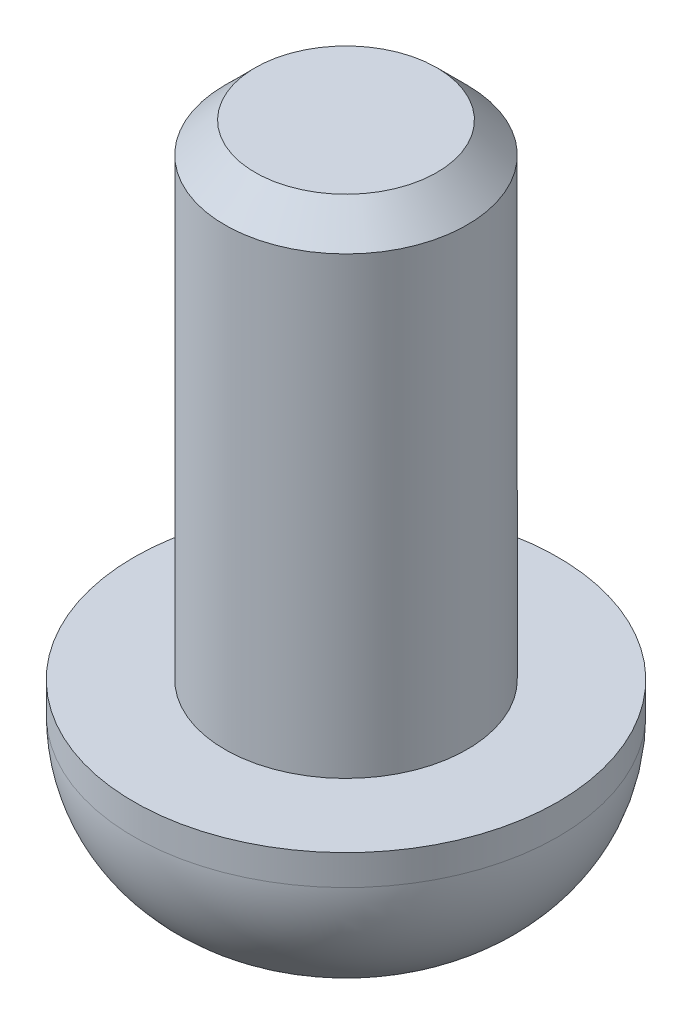
ISO-10303-21;
HEADER;
FILE_DESCRIPTION(('STEP AP214'),'2;1');
FILE_NAME('part.step','',(''),(''),'','','');
FILE_SCHEMA(('AUTOMOTIVE_DESIGN { 1 0 10303 214 1 1 1 1 }'));
ENDSEC;
DATA;
#1=APPLICATION_CONTEXT('core data for automotive mechanical design processes');
#2=APPLICATION_PROTOCOL_DEFINITION('international standard','automotive_design',2000,#1);
#3=PRODUCT_CONTEXT('',#1,'mechanical');
#4=PRODUCT('Part','Part','',(#3));
#5=PRODUCT_RELATED_PRODUCT_CATEGORY('part','',(#4));
#6=PRODUCT_DEFINITION_FORMATION('','',#4);
#7=PRODUCT_DEFINITION_CONTEXT('part definition',#1,'design');
#8=PRODUCT_DEFINITION('design','',#6,#7);
#9=PRODUCT_DEFINITION_SHAPE('','',#8);
#10=(LENGTH_UNIT() NAMED_UNIT(*) SI_UNIT(.MILLI.,.METRE.));
#11=(NAMED_UNIT(*) PLANE_ANGLE_UNIT() SI_UNIT($,.RADIAN.));
#12=(NAMED_UNIT(*) SI_UNIT($,.STERADIAN.) SOLID_ANGLE_UNIT());
#13=UNCERTAINTY_MEASURE_WITH_UNIT(LENGTH_MEASURE(1.E-05),#10,'distance_accuracy_value','');
#14=(GEOMETRIC_REPRESENTATION_CONTEXT(3) GLOBAL_UNCERTAINTY_ASSIGNED_CONTEXT((#13)) GLOBAL_UNIT_ASSIGNED_CONTEXT((#10,
#11,#12)) REPRESENTATION_CONTEXT('',''));
#15=CARTESIAN_POINT('',(0.,0.,0.));
#16=DIRECTION('',(0.,0.,1.));
#17=DIRECTION('',(1.,0.,0.));
#18=AXIS2_PLACEMENT_3D('',#15,#16,#17);
#19=CARTESIAN_POINT('',(12.7,63.6,17.1));
#20=DIRECTION('',(0.,-1.,0.));
#21=DIRECTION('',(1.,0.,0.));
#22=AXIS2_PLACEMENT_3D('',#19,#20,#21);
#23=PLANE('',#22);
#24=DIRECTION('',(-0.5,0.,-0.866025403784439));
#25=VECTOR('',#24,1.);
#26=CARTESIAN_POINT('',(13.2629165124599,63.6,16.775));
#27=LINE('',#26,#25);
#28=CARTESIAN_POINT('',(13.0752776749733,63.6,16.45));
#29=VERTEX_POINT('',#28);
#30=CARTESIAN_POINT('',(13.4505553499465,63.6,17.1));
#31=VERTEX_POINT('',#30);
#32=EDGE_CURVE('E67',#29,#31,#27,.F.);
#33=ORIENTED_EDGE('',*,*,#32,.T.);
#34=DIRECTION('',(0.5,0.,-0.866025403784439));
#35=VECTOR('',#34,1.);
#36=CARTESIAN_POINT('',(13.2629165124599,63.6,17.425));
#37=LINE('',#36,#35);
#38=CARTESIAN_POINT('',(13.0752776749733,63.6,17.75));
#39=VERTEX_POINT('',#38);
#40=EDGE_CURVE('E69',#31,#39,#37,.F.);
#41=ORIENTED_EDGE('',*,*,#40,.T.);
#42=DIRECTION('',(1.,0.,0.));
#43=VECTOR('',#42,1.);
#44=CARTESIAN_POINT('',(12.8876388374866,63.6,17.75));
#45=LINE('',#44,#43);
#46=CARTESIAN_POINT('',(12.3247223250267,63.6,17.75));
#47=VERTEX_POINT('',#46);
#48=EDGE_CURVE('E71',#39,#47,#45,.F.);
#49=ORIENTED_EDGE('',*,*,#48,.T.);
#50=DIRECTION('',(0.5,0.,0.866025403784439));
#51=VECTOR('',#50,1.);
#52=CARTESIAN_POINT('',(12.1370834875401,63.6,17.425));
#53=LINE('',#52,#51);
#54=CARTESIAN_POINT('',(11.9494446500535,63.6,17.1));
#55=VERTEX_POINT('',#54);
#56=EDGE_CURVE('E127',#47,#55,#53,.F.);
#57=ORIENTED_EDGE('',*,*,#56,.T.);
#58=DIRECTION('',(-0.5,0.,0.866025403784439));
#59=VECTOR('',#58,1.);
#60=CARTESIAN_POINT('',(12.1370834875401,63.6,16.775));
#61=LINE('',#60,#59);
#62=CARTESIAN_POINT('',(12.3247223250267,63.6,16.45));
#63=VERTEX_POINT('',#62);
#64=EDGE_CURVE('E132',#55,#63,#61,.F.);
#65=ORIENTED_EDGE('',*,*,#64,.T.);
#66=DIRECTION('',(-1.,0.,0.));
#67=VECTOR('',#66,1.);
#68=CARTESIAN_POINT('',(12.7,63.6,16.45));
#69=LINE('',#68,#67);
#70=EDGE_CURVE('E136',#63,#29,#69,.F.);
#71=ORIENTED_EDGE('',*,*,#70,.T.);
#72=EDGE_LOOP('',(#33,#41,#49,#57,#65,#71));
#73=FACE_BOUND('',#72,.T.);
#74=ADVANCED_FACE('F16',(#73),#23,.T.);
#75=CARTESIAN_POINT('',(12.8876388374866,63.6,17.75));
#76=DIRECTION('',(0.,0.,1.));
#77=DIRECTION('',(0.,-1.,0.));
#78=AXIS2_PLACEMENT_3D('',#75,#76,#77);
#79=PLANE('',#78);
#80=DIRECTION('',(0.,1.,0.));
#81=VECTOR('',#80,1.);
#82=CARTESIAN_POINT('',(12.3247223250267,63.6,17.75));
#83=LINE('',#82,#81);
#84=CARTESIAN_POINT('',(12.3247223250267,63.,17.75));
#85=VERTEX_POINT('',#84);
#86=EDGE_CURVE('E82',#85,#47,#83,.T.);
#87=ORIENTED_EDGE('',*,*,#86,.T.);
#88=ORIENTED_EDGE('',*,*,#48,.F.);
#89=DIRECTION('',(0.,1.,0.));
#90=VECTOR('',#89,1.);
#91=CARTESIAN_POINT('',(13.0752776749733,63.6,17.75));
#92=LINE('',#91,#90);
#93=CARTESIAN_POINT('',(13.0752776749733,63.,17.75));
#94=VERTEX_POINT('',#93);
#95=EDGE_CURVE('E76',#39,#94,#92,.F.);
#96=ORIENTED_EDGE('',*,*,#95,.T.);
#97=DIRECTION('',(1.,0.,0.));
#98=VECTOR('',#97,1.);
#99=CARTESIAN_POINT('',(12.7,63.,17.75));
#100=LINE('',#99,#98);
#101=EDGE_CURVE('E124',#85,#94,#100,.T.);
#102=ORIENTED_EDGE('',*,*,#101,.F.);
#103=EDGE_LOOP('',(#87,#88,#96,#102));
#104=FACE_BOUND('',#103,.T.);
#105=ADVANCED_FACE('F79',(#104),#79,.F.);
#106=CARTESIAN_POINT('',(13.2629165124599,63.6,17.425));
#107=DIRECTION('',(0.866025403784439,0.,0.5));
#108=DIRECTION('',(0.5,0.,-0.866025403784439));
#109=AXIS2_PLACEMENT_3D('',#106,#107,#108);
#110=PLANE('',#109);
#111=ORIENTED_EDGE('',*,*,#95,.F.);
#112=ORIENTED_EDGE('',*,*,#40,.F.);
#113=DIRECTION('',(0.,1.,0.));
#114=VECTOR('',#113,1.);
#115=CARTESIAN_POINT('',(13.4505553499465,63.6,17.1));
#116=LINE('',#115,#114);
#117=CARTESIAN_POINT('',(13.4505553499465,63.,17.1));
#118=VERTEX_POINT('',#117);
#119=EDGE_CURVE('E90',#31,#118,#116,.F.);
#120=ORIENTED_EDGE('',*,*,#119,.T.);
#121=DIRECTION('',(0.499999999999999,0.,-0.866025403784439));
#122=VECTOR('',#121,1.);
#123=CARTESIAN_POINT('',(13.0752776749733,63.,17.75));
#124=LINE('',#123,#122);
#125=EDGE_CURVE('E87',#94,#118,#124,.T.);
#126=ORIENTED_EDGE('',*,*,#125,.F.);
#127=EDGE_LOOP('',(#111,#112,#120,#126));
#128=FACE_BOUND('',#127,.T.);
#129=ADVANCED_FACE('F85',(#128),#110,.F.);
#130=CARTESIAN_POINT('',(13.2629165124599,63.6,16.775));
#131=DIRECTION('',(0.866025403784439,0.,-0.5));
#132=DIRECTION('',(-0.5,0.,-0.866025403784439));
#133=AXIS2_PLACEMENT_3D('',#130,#131,#132);
#134=PLANE('',#133);
#135=ORIENTED_EDGE('',*,*,#119,.F.);
#136=ORIENTED_EDGE('',*,*,#32,.F.);
#137=DIRECTION('',(0.,1.,0.));
#138=VECTOR('',#137,1.);
#139=CARTESIAN_POINT('',(13.0752776749733,63.6,16.45));
#140=LINE('',#139,#138);
#141=CARTESIAN_POINT('',(13.0752776749733,63.,16.45));
#142=VERTEX_POINT('',#141);
#143=EDGE_CURVE('E134',#29,#142,#140,.F.);
#144=ORIENTED_EDGE('',*,*,#143,.T.);
#145=DIRECTION('',(-0.500000000000001,0.,-0.866025403784438));
#146=VECTOR('',#145,1.);
#147=CARTESIAN_POINT('',(13.4505553499465,63.,17.1));
#148=LINE('',#147,#146);
#149=EDGE_CURVE('E120',#118,#142,#148,.T.);
#150=ORIENTED_EDGE('',*,*,#149,.F.);
#151=EDGE_LOOP('',(#135,#136,#144,#150));
#152=FACE_BOUND('',#151,.T.);
#153=ADVANCED_FACE('F139',(#152),#134,.F.);
#154=CARTESIAN_POINT('',(12.7,63.6,16.45));
#155=DIRECTION('',(0.,0.,-1.));
#156=DIRECTION('',(-1.,0.,0.));
#157=AXIS2_PLACEMENT_3D('',#154,#155,#156);
#158=PLANE('',#157);
#159=ORIENTED_EDGE('',*,*,#143,.F.);
#160=ORIENTED_EDGE('',*,*,#70,.F.);
#161=DIRECTION('',(0.,1.,0.));
#162=VECTOR('',#161,1.);
#163=CARTESIAN_POINT('',(12.3247223250267,63.6,16.45));
#164=LINE('',#163,#162);
#165=CARTESIAN_POINT('',(12.3247223250267,63.,16.45));
#166=VERTEX_POINT('',#165);
#167=EDGE_CURVE('E130',#63,#166,#164,.F.);
#168=ORIENTED_EDGE('',*,*,#167,.T.);
#169=DIRECTION('',(1.,0.,0.));
#170=VECTOR('',#169,1.);
#171=CARTESIAN_POINT('',(12.7,63.,16.45));
#172=LINE('',#171,#170);
#173=EDGE_CURVE('E117',#142,#166,#172,.F.);
#174=ORIENTED_EDGE('',*,*,#173,.F.);
#175=EDGE_LOOP('',(#159,#160,#168,#174));
#176=FACE_BOUND('',#175,.T.);
#177=ADVANCED_FACE('F150',(#176),#158,.F.);
#178=CARTESIAN_POINT('',(12.1370834875401,63.6,16.775));
#179=DIRECTION('',(-0.866025403784439,0.,-0.5));
#180=DIRECTION('',(-0.5,0.,0.866025403784439));
#181=AXIS2_PLACEMENT_3D('',#178,#179,#180);
#182=PLANE('',#181);
#183=ORIENTED_EDGE('',*,*,#167,.F.);
#184=ORIENTED_EDGE('',*,*,#64,.F.);
#185=DIRECTION('',(0.,1.,0.));
#186=VECTOR('',#185,1.);
#187=CARTESIAN_POINT('',(11.9494446500535,63.6,17.1));
#188=LINE('',#187,#186);
#189=CARTESIAN_POINT('',(11.9494446500535,63.,17.1));
#190=VERTEX_POINT('',#189);
#191=EDGE_CURVE('E34',#55,#190,#188,.F.);
#192=ORIENTED_EDGE('',*,*,#191,.T.);
#193=DIRECTION('',(-0.500000000000001,0.,0.866025403784438));
#194=VECTOR('',#193,1.);
#195=CARTESIAN_POINT('',(12.3247223250267,63.,16.45));
#196=LINE('',#195,#194);
#197=EDGE_CURVE('E114',#166,#190,#196,.T.);
#198=ORIENTED_EDGE('',*,*,#197,.F.);
#199=EDGE_LOOP('',(#183,#184,#192,#198));
#200=FACE_BOUND('',#199,.T.);
#201=ADVANCED_FACE('F148',(#200),#182,.F.);
#202=CARTESIAN_POINT('',(12.1370834875401,63.6,17.425));
#203=DIRECTION('',(-0.866025403784439,0.,0.5));
#204=DIRECTION('',(0.5,0.,0.866025403784439));
#205=AXIS2_PLACEMENT_3D('',#202,#203,#204);
#206=PLANE('',#205);
#207=ORIENTED_EDGE('',*,*,#191,.F.);
#208=ORIENTED_EDGE('',*,*,#56,.F.);
#209=ORIENTED_EDGE('',*,*,#86,.F.);
#210=DIRECTION('',(0.499999999999999,0.,0.866025403784439));
#211=VECTOR('',#210,1.);
#212=CARTESIAN_POINT('',(11.9494446500535,63.,17.1));
#213=LINE('',#212,#211);
#214=EDGE_CURVE('E108',#190,#85,#213,.T.);
#215=ORIENTED_EDGE('',*,*,#214,.F.);
#216=EDGE_LOOP('',(#207,#208,#209,#215));
#217=FACE_BOUND('',#216,.T.);
#218=ADVANCED_FACE('F145',(#217),#206,.F.);
#219=CARTESIAN_POINT('',(12.7,63.,17.6891165));
#220=DIRECTION('',(0.,-1.,0.));
#221=DIRECTION('',(0.,0.,-1.));
#222=AXIS2_PLACEMENT_3D('',#219,#220,#221);
#223=PLANE('',#222);
#224=CARTESIAN_POINT('',(12.7,63.,17.1));
#225=DIRECTION('',(0.,1.,0.));
#226=DIRECTION('',(-1.,0.,0.));
#227=AXIS2_PLACEMENT_3D('',#224,#225,#226);
#228=CIRCLE('',#227,1.178233);
#229=CARTESIAN_POINT('',(11.521767,63.,17.1));
#230=VERTEX_POINT('',#229);
#231=EDGE_CURVE('E19',#230,#230,#228,.T.);
#232=ORIENTED_EDGE('',*,*,#231,.F.);
#233=EDGE_LOOP('',(#232));
#234=FACE_BOUND('',#233,.T.);
#235=ORIENTED_EDGE('',*,*,#197,.T.);
#236=ORIENTED_EDGE('',*,*,#214,.T.);
#237=ORIENTED_EDGE('',*,*,#101,.T.);
#238=ORIENTED_EDGE('',*,*,#125,.T.);
#239=ORIENTED_EDGE('',*,*,#149,.T.);
#240=ORIENTED_EDGE('',*,*,#173,.T.);
#241=EDGE_LOOP('',(#235,#236,#237,#238,#239,#240));
#242=FACE_BOUND('',#241,.T.);
#243=ADVANCED_FACE('F143',(#234,#242),#223,.T.);
#244=CARTESIAN_POINT('',(12.2000000037596,64.0500000009573,17.1));
#245=DIRECTION('',(0.,0.,1.));
#246=DIRECTION('',(-1.,0.,0.));
#247=AXIS2_PLACEMENT_3D('',#244,#245,#246);
#248=CIRCLE('',#247,1.25000000375964);
#249=TRIMMED_CURVE('',#248,(PARAMETER_VALUE(-1.98231316826803)),
(PARAMETER_VALUE(1.98231316826803)),.T.,.PARAMETER.);
#250=CARTESIAN_POINT('',(12.7,64.0500000009573,17.1));
#251=DIRECTION('',(0.,1.,0.));
#252=AXIS1_PLACEMENT('',#250,#251);
#253=SURFACE_OF_REVOLUTION('',#249,#252);
#254=ORIENTED_EDGE('',*,*,#231,.T.);
#255=EDGE_LOOP('',(#254));
#256=FACE_BOUND('',#255,.T.);
#257=CARTESIAN_POINT('',(12.7,64.05,17.1));
#258=DIRECTION('',(0.,1.,0.));
#259=DIRECTION('',(-1.,0.,0.));
#260=AXIS2_PLACEMENT_3D('',#257,#258,#259);
#261=CIRCLE('',#260,1.75);
#262=CARTESIAN_POINT('',(10.95,64.05,17.1));
#263=VERTEX_POINT('',#262);
#264=EDGE_CURVE('E100',#263,#263,#261,.T.);
#265=ORIENTED_EDGE('',*,*,#264,.F.);
#266=EDGE_LOOP('',(#265));
#267=FACE_BOUND('',#266,.T.);
#268=ADVANCED_FACE('F183',(#256,#267),#253,.F.);
#269=CARTESIAN_POINT('',(12.7,64.175,17.1));
#270=DIRECTION('',(0.,1.,0.));
#271=DIRECTION('',(-1.,0.,0.));
#272=AXIS2_PLACEMENT_3D('',#269,#270,#271);
#273=CYLINDRICAL_SURFACE('',#272,1.75);
#274=CARTESIAN_POINT('',(12.7,64.3,17.1));
#275=DIRECTION('',(0.,1.,0.));
#276=DIRECTION('',(-1.,0.,0.));
#277=AXIS2_PLACEMENT_3D('',#274,#275,#276);
#278=CIRCLE('',#277,1.75);
#279=CARTESIAN_POINT('',(10.95,64.3,17.1));
#280=VERTEX_POINT('',#279);
#281=EDGE_CURVE('E98',#280,#280,#278,.T.);
#282=ORIENTED_EDGE('',*,*,#281,.F.);
#283=EDGE_LOOP('',(#282));
#284=FACE_BOUND('',#283,.T.);
#285=ORIENTED_EDGE('',*,*,#264,.T.);
#286=EDGE_LOOP('',(#285));
#287=FACE_BOUND('',#286,.T.);
#288=ADVANCED_FACE('F179',(#284,#287),#273,.T.);
#289=CARTESIAN_POINT('',(12.7,68.3,17.475));
#290=DIRECTION('',(0.,1.,0.));
#291=DIRECTION('',(0.,0.,1.));
#292=AXIS2_PLACEMENT_3D('',#289,#290,#291);
#293=PLANE('',#292);
#294=CARTESIAN_POINT('',(12.7,68.2999999999652,17.1));
#295=DIRECTION('',(0.,-1.,0.));
#296=DIRECTION('',(0.,0.,-1.));
#297=AXIS2_PLACEMENT_3D('',#294,#295,#296);
#298=CIRCLE('',#297,0.750000000009913);
#299=CARTESIAN_POINT('',(12.7,68.2999999999652,16.3499999999901));
#300=VERTEX_POINT('',#299);
#301=EDGE_CURVE('E96',#300,#300,#298,.T.);
#302=ORIENTED_EDGE('',*,*,#301,.F.);
#303=EDGE_LOOP('',(#302));
#304=FACE_BOUND('',#303,.T.);
#305=ADVANCED_FACE('F176',(#304),#293,.T.);
#306=CARTESIAN_POINT('',(12.7,64.3,18.475));
#307=DIRECTION('',(0.,1.,0.));
#308=DIRECTION('',(0.,0.,1.));
#309=AXIS2_PLACEMENT_3D('',#306,#307,#308);
#310=PLANE('',#309);
#311=ORIENTED_EDGE('',*,*,#281,.T.);
#312=EDGE_LOOP('',(#311));
#313=FACE_BOUND('',#312,.T.);
#314=CARTESIAN_POINT('',(12.7,64.3,17.1));
#315=DIRECTION('',(0.,1.,0.));
#316=DIRECTION('',(-1.,0.,0.));
#317=AXIS2_PLACEMENT_3D('',#314,#315,#316);
#318=CIRCLE('',#317,1.);
#319=CARTESIAN_POINT('',(11.7,64.3,17.1));
#320=VERTEX_POINT('',#319);
#321=EDGE_CURVE('E25',#320,#320,#318,.T.);
#322=ORIENTED_EDGE('',*,*,#321,.F.);
#323=EDGE_LOOP('',(#322));
#324=FACE_BOUND('',#323,.T.);
#325=ADVANCED_FACE('F169',(#313,#324),#310,.T.);
#326=CARTESIAN_POINT('',(12.7,68.0500000000279,17.1));
#327=DIRECTION('',(0.,-1.,0.));
#328=DIRECTION('',(0.,0.,-1.));
#329=AXIS2_PLACEMENT_3D('',#326,#327,#328);
#330=CONICAL_SURFACE('',#329,0.999999999947158,0.785398163397448);
#331=ORIENTED_EDGE('',*,*,#301,.T.);
#332=EDGE_LOOP('',(#331));
#333=FACE_BOUND('',#332,.T.);
#334=CARTESIAN_POINT('',(12.7,68.05,17.1));
#335=DIRECTION('',(0.,1.,0.));
#336=DIRECTION('',(-1.,0.,0.));
#337=AXIS2_PLACEMENT_3D('',#334,#335,#336);
#338=CIRCLE('',#337,1.);
#339=CARTESIAN_POINT('',(11.7,68.05,17.1));
#340=VERTEX_POINT('',#339);
#341=EDGE_CURVE('E11',#340,#340,#338,.F.);
#342=ORIENTED_EDGE('',*,*,#341,.F.);
#343=EDGE_LOOP('',(#342));
#344=FACE_BOUND('',#343,.T.);
#345=ADVANCED_FACE('F162',(#333,#344),#330,.T.);
#346=CARTESIAN_POINT('',(12.7,66.175,17.1));
#347=DIRECTION('',(0.,1.,0.));
#348=DIRECTION('',(-1.,0.,0.));
#349=AXIS2_PLACEMENT_3D('',#346,#347,#348);
#350=CYLINDRICAL_SURFACE('',#349,1.);
#351=ORIENTED_EDGE('',*,*,#321,.T.);
#352=EDGE_LOOP('',(#351));
#353=FACE_BOUND('',#352,.T.);
#354=ORIENTED_EDGE('',*,*,#341,.T.);
#355=EDGE_LOOP('',(#354));
#356=FACE_BOUND('',#355,.T.);
#357=ADVANCED_FACE('F160',(#353,#356),#350,.T.);
#358=CLOSED_SHELL('',(#74,#105,#129,#153,#177,#201,#218,#243,#268,#288,#305,#325,#345,#357));
#359=MANIFOLD_SOLID_BREP('B1',#358);
#360=ADVANCED_BREP_SHAPE_REPRESENTATION('',(#18,#359),#14);
#361=SHAPE_DEFINITION_REPRESENTATION(#9,#360);
ENDSEC;
END-ISO-10303-21;
